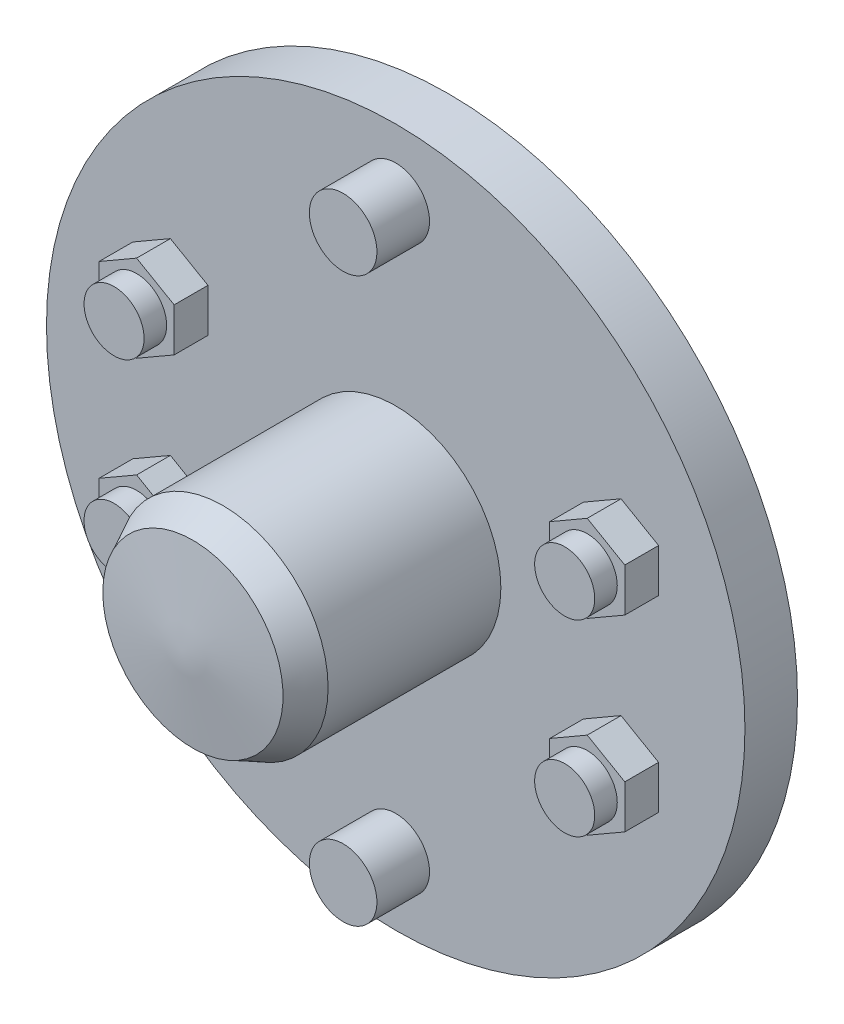
ISO-10303-21;
HEADER;
FILE_DESCRIPTION(('STEP AP214'),'2;1');
FILE_NAME('part.step','',(''),(''),'','','');
FILE_SCHEMA(('AUTOMOTIVE_DESIGN { 1 0 10303 214 1 1 1 1 }'));
ENDSEC;
DATA;
#1=APPLICATION_CONTEXT('core data for automotive mechanical design processes');
#2=APPLICATION_PROTOCOL_DEFINITION('international standard','automotive_design',2000,#1);
#3=PRODUCT_CONTEXT('',#1,'mechanical');
#4=PRODUCT('Part','Part','',(#3));
#5=PRODUCT_RELATED_PRODUCT_CATEGORY('part','',(#4));
#6=PRODUCT_DEFINITION_FORMATION('','',#4);
#7=PRODUCT_DEFINITION_CONTEXT('part definition',#1,'design');
#8=PRODUCT_DEFINITION('design','',#6,#7);
#9=PRODUCT_DEFINITION_SHAPE('','',#8);
#10=(LENGTH_UNIT() NAMED_UNIT(*) SI_UNIT(.MILLI.,.METRE.));
#11=(NAMED_UNIT(*) PLANE_ANGLE_UNIT() SI_UNIT($,.RADIAN.));
#12=(NAMED_UNIT(*) SI_UNIT($,.STERADIAN.) SOLID_ANGLE_UNIT());
#13=UNCERTAINTY_MEASURE_WITH_UNIT(LENGTH_MEASURE(1.E-05),#10,'distance_accuracy_value','');
#14=(GEOMETRIC_REPRESENTATION_CONTEXT(3) GLOBAL_UNCERTAINTY_ASSIGNED_CONTEXT((#13)) GLOBAL_UNIT_ASSIGNED_CONTEXT((#10,
#11,#12)) REPRESENTATION_CONTEXT('',''));
#15=CARTESIAN_POINT('',(0.,0.,0.));
#16=DIRECTION('',(0.,0.,1.));
#17=DIRECTION('',(1.,0.,0.));
#18=AXIS2_PLACEMENT_3D('',#15,#16,#17);
#19=CARTESIAN_POINT('',(190.,-30.7735026918963,332.));
#20=DIRECTION('',(-1.,0.,0.));
#21=DIRECTION('',(0.,0.,1.));
#22=AXIS2_PLACEMENT_3D('',#19,#20,#21);
#23=PLANE('',#22);
#24=DIRECTION('',(0.,1.,0.));
#25=VECTOR('',#24,1.);
#26=CARTESIAN_POINT('',(190.,-30.7735026918963,323.));
#27=LINE('',#26,#25);
#28=CARTESIAN_POINT('',(190.,-30.7735026918963,323.));
#29=VERTEX_POINT('',#28);
#30=CARTESIAN_POINT('',(190.,-19.2264973081037,323.));
#31=VERTEX_POINT('',#30);
#32=EDGE_CURVE('E226',#29,#31,#27,.T.);
#33=ORIENTED_EDGE('',*,*,#32,.T.);
#34=DIRECTION('',(0.,0.,-1.));
#35=VECTOR('',#34,1.);
#36=CARTESIAN_POINT('',(190.,-19.2264973081037,332.));
#37=LINE('',#36,#35);
#38=CARTESIAN_POINT('',(190.,-19.2264973081037,332.));
#39=VERTEX_POINT('',#38);
#40=EDGE_CURVE('E42',#39,#31,#37,.T.);
#41=ORIENTED_EDGE('',*,*,#40,.F.);
#42=DIRECTION('',(0.,1.,0.));
#43=VECTOR('',#42,1.);
#44=CARTESIAN_POINT('',(190.,-30.7735026918963,332.));
#45=LINE('',#44,#43);
#46=CARTESIAN_POINT('',(190.,-30.7735026918963,332.));
#47=VERTEX_POINT('',#46);
#48=EDGE_CURVE('E255',#47,#39,#45,.T.);
#49=ORIENTED_EDGE('',*,*,#48,.F.);
#50=DIRECTION('',(0.,0.,-1.));
#51=VECTOR('',#50,1.);
#52=CARTESIAN_POINT('',(190.,-30.7735026918963,332.));
#53=LINE('',#52,#51);
#54=EDGE_CURVE('E228',#47,#29,#53,.T.);
#55=ORIENTED_EDGE('',*,*,#54,.T.);
#56=EDGE_LOOP('',(#33,#41,#49,#55));
#57=FACE_BOUND('',#56,.T.);
#58=ADVANCED_FACE('F41',(#57),#23,.F.);
#59=CARTESIAN_POINT('',(190.,-19.2264973081037,332.));
#60=DIRECTION('',(-0.5,-0.866025403784439,0.));
#61=DIRECTION('',(0.866025403784439,-0.5,0.));
#62=AXIS2_PLACEMENT_3D('',#59,#60,#61);
#63=PLANE('',#62);
#64=DIRECTION('',(-0.866025403784439,0.5,0.));
#65=VECTOR('',#64,1.);
#66=CARTESIAN_POINT('',(190.,-19.2264973081037,323.));
#67=LINE('',#66,#65);
#68=CARTESIAN_POINT('',(180.,-13.4529946162075,323.));
#69=VERTEX_POINT('',#68);
#70=EDGE_CURVE('E235',#31,#69,#67,.T.);
#71=ORIENTED_EDGE('',*,*,#70,.T.);
#72=DIRECTION('',(0.,0.,-1.));
#73=VECTOR('',#72,1.);
#74=CARTESIAN_POINT('',(180.,-13.4529946162075,332.));
#75=LINE('',#74,#73);
#76=CARTESIAN_POINT('',(180.,-13.4529946162075,332.));
#77=VERTEX_POINT('',#76);
#78=EDGE_CURVE('E262',#77,#69,#75,.T.);
#79=ORIENTED_EDGE('',*,*,#78,.F.);
#80=DIRECTION('',(-0.866025403784439,0.5,0.));
#81=VECTOR('',#80,1.);
#82=CARTESIAN_POINT('',(190.,-19.2264973081037,332.));
#83=LINE('',#82,#81);
#84=EDGE_CURVE('E267',#39,#77,#83,.T.);
#85=ORIENTED_EDGE('',*,*,#84,.F.);
#86=ORIENTED_EDGE('',*,*,#40,.T.);
#87=EDGE_LOOP('',(#71,#79,#85,#86));
#88=FACE_BOUND('',#87,.T.);
#89=ADVANCED_FACE('F216',(#88),#63,.F.);
#90=CARTESIAN_POINT('',(180.,-13.4529946162075,332.));
#91=DIRECTION('',(0.500000000000001,-0.866025403784438,0.));
#92=DIRECTION('',(0.866025403784438,0.500000000000001,0.));
#93=AXIS2_PLACEMENT_3D('',#90,#91,#92);
#94=PLANE('',#93);
#95=DIRECTION('',(-0.866025403784438,-0.500000000000001,0.));
#96=VECTOR('',#95,1.);
#97=CARTESIAN_POINT('',(180.,-13.4529946162075,323.));
#98=LINE('',#97,#96);
#99=CARTESIAN_POINT('',(170.,-19.2264973081037,323.));
#100=VERTEX_POINT('',#99);
#101=EDGE_CURVE('E237',#69,#100,#98,.T.);
#102=ORIENTED_EDGE('',*,*,#101,.T.);
#103=DIRECTION('',(0.,0.,-1.));
#104=VECTOR('',#103,1.);
#105=CARTESIAN_POINT('',(170.,-19.2264973081037,332.));
#106=LINE('',#105,#104);
#107=CARTESIAN_POINT('',(170.,-19.2264973081037,332.));
#108=VERTEX_POINT('',#107);
#109=EDGE_CURVE('E265',#108,#100,#106,.T.);
#110=ORIENTED_EDGE('',*,*,#109,.F.);
#111=DIRECTION('',(-0.866025403784438,-0.500000000000001,0.));
#112=VECTOR('',#111,1.);
#113=CARTESIAN_POINT('',(180.,-13.4529946162075,332.));
#114=LINE('',#113,#112);
#115=EDGE_CURVE('E269',#77,#108,#114,.T.);
#116=ORIENTED_EDGE('',*,*,#115,.F.);
#117=ORIENTED_EDGE('',*,*,#78,.T.);
#118=EDGE_LOOP('',(#102,#110,#116,#117));
#119=FACE_BOUND('',#118,.T.);
#120=ADVANCED_FACE('F219',(#119),#94,.F.);
#121=CARTESIAN_POINT('',(170.,-19.2264973081037,332.));
#122=DIRECTION('',(1.,0.,0.));
#123=DIRECTION('',(0.,0.,-1.));
#124=AXIS2_PLACEMENT_3D('',#121,#122,#123);
#125=PLANE('',#124);
#126=DIRECTION('',(0.,-1.,0.));
#127=VECTOR('',#126,1.);
#128=CARTESIAN_POINT('',(170.,-19.2264973081037,323.));
#129=LINE('',#128,#127);
#130=CARTESIAN_POINT('',(170.,-30.7735026918963,323.));
#131=VERTEX_POINT('',#130);
#132=EDGE_CURVE('E247',#100,#131,#129,.T.);
#133=ORIENTED_EDGE('',*,*,#132,.T.);
#134=DIRECTION('',(0.,0.,-1.));
#135=VECTOR('',#134,1.);
#136=CARTESIAN_POINT('',(170.,-30.7735026918963,332.));
#137=LINE('',#136,#135);
#138=CARTESIAN_POINT('',(170.,-30.7735026918963,332.));
#139=VERTEX_POINT('',#138);
#140=EDGE_CURVE('E259',#139,#131,#137,.T.);
#141=ORIENTED_EDGE('',*,*,#140,.F.);
#142=DIRECTION('',(0.,-1.,0.));
#143=VECTOR('',#142,1.);
#144=CARTESIAN_POINT('',(170.,-19.2264973081037,332.));
#145=LINE('',#144,#143);
#146=EDGE_CURVE('E279',#108,#139,#145,.T.);
#147=ORIENTED_EDGE('',*,*,#146,.F.);
#148=ORIENTED_EDGE('',*,*,#109,.T.);
#149=EDGE_LOOP('',(#133,#141,#147,#148));
#150=FACE_BOUND('',#149,.T.);
#151=ADVANCED_FACE('F286',(#150),#125,.F.);
#152=CARTESIAN_POINT('',(170.,-30.7735026918963,332.));
#153=DIRECTION('',(0.500000000000001,0.866025403784438,0.));
#154=DIRECTION('',(-0.866025403784438,0.500000000000001,0.));
#155=AXIS2_PLACEMENT_3D('',#152,#153,#154);
#156=PLANE('',#155);
#157=DIRECTION('',(0.866025403784438,-0.500000000000001,0.));
#158=VECTOR('',#157,1.);
#159=CARTESIAN_POINT('',(170.,-30.7735026918963,323.));
#160=LINE('',#159,#158);
#161=CARTESIAN_POINT('',(180.,-36.5470053837925,323.));
#162=VERTEX_POINT('',#161);
#163=EDGE_CURVE('E249',#131,#162,#160,.T.);
#164=ORIENTED_EDGE('',*,*,#163,.T.);
#165=DIRECTION('',(0.,0.,-1.));
#166=VECTOR('',#165,1.);
#167=CARTESIAN_POINT('',(180.,-36.5470053837925,332.));
#168=LINE('',#167,#166);
#169=CARTESIAN_POINT('',(180.,-36.5470053837925,332.));
#170=VERTEX_POINT('',#169);
#171=EDGE_CURVE('E258',#170,#162,#168,.T.);
#172=ORIENTED_EDGE('',*,*,#171,.F.);
#173=DIRECTION('',(0.866025403784438,-0.500000000000001,0.));
#174=VECTOR('',#173,1.);
#175=CARTESIAN_POINT('',(170.,-30.7735026918963,332.));
#176=LINE('',#175,#174);
#177=EDGE_CURVE('E276',#139,#170,#176,.T.);
#178=ORIENTED_EDGE('',*,*,#177,.F.);
#179=ORIENTED_EDGE('',*,*,#140,.T.);
#180=EDGE_LOOP('',(#164,#172,#178,#179));
#181=FACE_BOUND('',#180,.T.);
#182=ADVANCED_FACE('F285',(#181),#156,.F.);
#183=CARTESIAN_POINT('',(180.,-36.5470053837925,332.));
#184=DIRECTION('',(-0.5,0.866025403784439,0.));
#185=DIRECTION('',(-0.866025403784439,-0.5,0.));
#186=AXIS2_PLACEMENT_3D('',#183,#184,#185);
#187=PLANE('',#186);
#188=DIRECTION('',(0.866025403784439,0.5,0.));
#189=VECTOR('',#188,1.);
#190=CARTESIAN_POINT('',(180.,-36.5470053837925,323.));
#191=LINE('',#190,#189);
#192=EDGE_CURVE('E252',#162,#29,#191,.T.);
#193=ORIENTED_EDGE('',*,*,#192,.T.);
#194=ORIENTED_EDGE('',*,*,#54,.F.);
#195=DIRECTION('',(0.866025403784439,0.5,0.));
#196=VECTOR('',#195,1.);
#197=CARTESIAN_POINT('',(180.,-36.5470053837925,332.));
#198=LINE('',#197,#196);
#199=EDGE_CURVE('E60',#170,#47,#198,.T.);
#200=ORIENTED_EDGE('',*,*,#199,.F.);
#201=ORIENTED_EDGE('',*,*,#171,.T.);
#202=EDGE_LOOP('',(#193,#194,#200,#201));
#203=FACE_BOUND('',#202,.T.);
#204=ADVANCED_FACE('F290',(#203),#187,.F.);
#205=CARTESIAN_POINT('',(0.,0.,332.));
#206=DIRECTION('',(0.,0.,1.));
#207=DIRECTION('',(1.,0.,0.));
#208=AXIS2_PLACEMENT_3D('',#205,#206,#207);
#209=PLANE('',#208);
#210=CARTESIAN_POINT('',(180.,-25.,332.));
#211=DIRECTION('',(0.,0.,1.));
#212=DIRECTION('',(1.,0.,0.));
#213=AXIS2_PLACEMENT_3D('',#210,#211,#212);
#214=CIRCLE('',#213,8.00000000000001);
#215=CARTESIAN_POINT('',(188.,-25.,332.));
#216=VERTEX_POINT('',#215);
#217=EDGE_CURVE('E11',#216,#216,#214,.T.);
#218=ORIENTED_EDGE('',*,*,#217,.F.);
#219=EDGE_LOOP('',(#218));
#220=FACE_BOUND('',#219,.T.);
#221=ORIENTED_EDGE('',*,*,#48,.T.);
#222=ORIENTED_EDGE('',*,*,#84,.T.);
#223=ORIENTED_EDGE('',*,*,#115,.T.);
#224=ORIENTED_EDGE('',*,*,#146,.T.);
#225=ORIENTED_EDGE('',*,*,#177,.T.);
#226=ORIENTED_EDGE('',*,*,#199,.T.);
#227=EDGE_LOOP('',(#221,#222,#223,#224,#225,#226));
#228=FACE_BOUND('',#227,.T.);
#229=ADVANCED_FACE('F275',(#220,#228),#209,.T.);
#230=CARTESIAN_POINT('',(240.,0.,323.));
#231=DIRECTION('',(0.,0.,1.));
#232=DIRECTION('',(1.,0.,0.));
#233=AXIS2_PLACEMENT_3D('',#230,#231,#232);
#234=PLANE('',#233);
#235=DIRECTION('',(0.,1.,0.));
#236=VECTOR('',#235,1.);
#237=CARTESIAN_POINT('',(310.,19.2264973081037,323.));
#238=LINE('',#237,#236);
#239=CARTESIAN_POINT('',(310.,19.2264973081037,323.));
#240=VERTEX_POINT('',#239);
#241=CARTESIAN_POINT('',(310.,30.7735026918963,323.));
#242=VERTEX_POINT('',#241);
#243=EDGE_CURVE('E574',#240,#242,#238,.T.);
#244=ORIENTED_EDGE('',*,*,#243,.F.);
#245=DIRECTION('',(0.866025403784439,0.5,0.));
#246=VECTOR('',#245,1.);
#247=CARTESIAN_POINT('',(300.,13.4529946162075,323.));
#248=LINE('',#247,#246);
#249=CARTESIAN_POINT('',(300.,13.4529946162075,323.));
#250=VERTEX_POINT('',#249);
#251=EDGE_CURVE('E576',#250,#240,#248,.T.);
#252=ORIENTED_EDGE('',*,*,#251,.F.);
#253=DIRECTION('',(0.866025403784439,-0.5,0.));
#254=VECTOR('',#253,1.);
#255=CARTESIAN_POINT('',(290.,19.2264973081037,323.));
#256=LINE('',#255,#254);
#257=CARTESIAN_POINT('',(290.,19.2264973081037,323.));
#258=VERTEX_POINT('',#257);
#259=EDGE_CURVE('E605',#258,#250,#256,.T.);
#260=ORIENTED_EDGE('',*,*,#259,.F.);
#261=DIRECTION('',(0.,-1.,0.));
#262=VECTOR('',#261,1.);
#263=CARTESIAN_POINT('',(290.,30.7735026918963,323.));
#264=LINE('',#263,#262);
#265=CARTESIAN_POINT('',(290.,30.7735026918963,323.));
#266=VERTEX_POINT('',#265);
#267=EDGE_CURVE('E597',#266,#258,#264,.T.);
#268=ORIENTED_EDGE('',*,*,#267,.F.);
#269=DIRECTION('',(-0.866025403784439,-0.499999999999999,0.));
#270=VECTOR('',#269,1.);
#271=CARTESIAN_POINT('',(300.,36.5470053837925,323.));
#272=LINE('',#271,#270);
#273=CARTESIAN_POINT('',(300.,36.5470053837925,323.));
#274=VERTEX_POINT('',#273);
#275=EDGE_CURVE('E596',#274,#266,#272,.T.);
#276=ORIENTED_EDGE('',*,*,#275,.F.);
#277=DIRECTION('',(-0.866025403784439,0.5,0.));
#278=VECTOR('',#277,1.);
#279=CARTESIAN_POINT('',(310.,30.7735026918963,323.));
#280=LINE('',#279,#278);
#281=EDGE_CURVE('E593',#242,#274,#280,.T.);
#282=ORIENTED_EDGE('',*,*,#281,.F.);
#283=EDGE_LOOP('',(#244,#252,#260,#268,#276,#282));
#284=FACE_BOUND('',#283,.T.);
#285=CARTESIAN_POINT('',(240.,0.,323.));
#286=DIRECTION('',(0.,0.,1.));
#287=DIRECTION('',(1.,0.,0.));
#288=AXIS2_PLACEMENT_3D('',#285,#286,#287);
#289=CIRCLE('',#288,28.);
#290=CARTESIAN_POINT('',(268.,0.,323.));
#291=VERTEX_POINT('',#290);
#292=EDGE_CURVE('E563',#291,#291,#289,.T.);
#293=ORIENTED_EDGE('',*,*,#292,.F.);
#294=EDGE_LOOP('',(#293));
#295=FACE_BOUND('',#294,.T.);
#296=CARTESIAN_POINT('',(240.,75.,323.));
#297=DIRECTION('',(0.,0.,1.));
#298=DIRECTION('',(1.,0.,0.));
#299=AXIS2_PLACEMENT_3D('',#296,#297,#298);
#300=CIRCLE('',#299,9.00000000000001);
#301=CARTESIAN_POINT('',(249.,75.,323.));
#302=VERTEX_POINT('',#301);
#303=EDGE_CURVE('E557',#302,#302,#300,.T.);
#304=ORIENTED_EDGE('',*,*,#303,.F.);
#305=EDGE_LOOP('',(#304));
#306=FACE_BOUND('',#305,.T.);
#307=DIRECTION('',(0.,1.,0.));
#308=VECTOR('',#307,1.);
#309=CARTESIAN_POINT('',(310.,-30.7735026918963,323.));
#310=LINE('',#309,#308);
#311=CARTESIAN_POINT('',(310.,-30.7735026918963,323.));
#312=VERTEX_POINT('',#311);
#313=CARTESIAN_POINT('',(310.,-19.2264973081037,323.));
#314=VERTEX_POINT('',#313);
#315=EDGE_CURVE('E459',#312,#314,#310,.T.);
#316=ORIENTED_EDGE('',*,*,#315,.F.);
#317=DIRECTION('',(0.866025403784439,0.5,0.));
#318=VECTOR('',#317,1.);
#319=CARTESIAN_POINT('',(300.,-36.5470053837925,323.));
#320=LINE('',#319,#318);
#321=CARTESIAN_POINT('',(300.,-36.5470053837925,323.));
#322=VERTEX_POINT('',#321);
#323=EDGE_CURVE('E467',#322,#312,#320,.T.);
#324=ORIENTED_EDGE('',*,*,#323,.F.);
#325=DIRECTION('',(0.866025403784439,-0.5,0.));
#326=VECTOR('',#325,1.);
#327=CARTESIAN_POINT('',(290.,-30.7735026918963,323.));
#328=LINE('',#327,#326);
#329=CARTESIAN_POINT('',(290.,-30.7735026918963,323.));
#330=VERTEX_POINT('',#329);
#331=EDGE_CURVE('E488',#330,#322,#328,.T.);
#332=ORIENTED_EDGE('',*,*,#331,.F.);
#333=DIRECTION('',(0.,-1.,0.));
#334=VECTOR('',#333,1.);
#335=CARTESIAN_POINT('',(290.,-19.2264973081037,323.));
#336=LINE('',#335,#334);
#337=CARTESIAN_POINT('',(290.,-19.2264973081037,323.));
#338=VERTEX_POINT('',#337);
#339=EDGE_CURVE('E484',#338,#330,#336,.T.);
#340=ORIENTED_EDGE('',*,*,#339,.F.);
#341=DIRECTION('',(-0.866025403784439,-0.499999999999999,0.));
#342=VECTOR('',#341,1.);
#343=CARTESIAN_POINT('',(300.,-13.4529946162075,323.));
#344=LINE('',#343,#342);
#345=CARTESIAN_POINT('',(300.,-13.4529946162075,323.));
#346=VERTEX_POINT('',#345);
#347=EDGE_CURVE('E485',#346,#338,#344,.T.);
#348=ORIENTED_EDGE('',*,*,#347,.F.);
#349=DIRECTION('',(-0.866025403784439,0.5,0.));
#350=VECTOR('',#349,1.);
#351=CARTESIAN_POINT('',(310.,-19.2264973081037,323.));
#352=LINE('',#351,#350);
#353=EDGE_CURVE('E479',#314,#346,#352,.T.);
#354=ORIENTED_EDGE('',*,*,#353,.F.);
#355=EDGE_LOOP('',(#316,#324,#332,#340,#348,#354));
#356=FACE_BOUND('',#355,.T.);
#357=CARTESIAN_POINT('',(240.,-75.,323.));
#358=DIRECTION('',(0.,0.,1.));
#359=DIRECTION('',(1.,0.,0.));
#360=AXIS2_PLACEMENT_3D('',#357,#358,#359);
#361=CIRCLE('',#360,9.00000000000001);
#362=CARTESIAN_POINT('',(249.,-75.,323.));
#363=VERTEX_POINT('',#362);
#364=EDGE_CURVE('E454',#363,#363,#361,.T.);
#365=ORIENTED_EDGE('',*,*,#364,.F.);
#366=EDGE_LOOP('',(#365));
#367=FACE_BOUND('',#366,.T.);
#368=CARTESIAN_POINT('',(240.,0.,323.));
#369=DIRECTION('',(0.,0.,1.));
#370=DIRECTION('',(1.,0.,0.));
#371=AXIS2_PLACEMENT_3D('',#368,#369,#370);
#372=CIRCLE('',#371,93.);
#373=CARTESIAN_POINT('',(333.,0.,323.));
#374=VERTEX_POINT('',#373);
#375=EDGE_CURVE('E445',#374,#374,#372,.T.);
#376=ORIENTED_EDGE('',*,*,#375,.T.);
#377=EDGE_LOOP('',(#376));
#378=FACE_BOUND('',#377,.T.);
#379=DIRECTION('',(0.,1.,0.));
#380=VECTOR('',#379,1.);
#381=CARTESIAN_POINT('',(190.,19.2264973081037,323.));
#382=LINE('',#381,#380);
#383=CARTESIAN_POINT('',(190.,19.2264973081037,323.));
#384=VERTEX_POINT('',#383);
#385=CARTESIAN_POINT('',(190.,30.7735026918963,323.));
#386=VERTEX_POINT('',#385);
#387=EDGE_CURVE('E452',#384,#386,#382,.T.);
#388=ORIENTED_EDGE('',*,*,#387,.F.);
#389=DIRECTION('',(0.866025403784439,0.5,0.));
#390=VECTOR('',#389,1.);
#391=CARTESIAN_POINT('',(180.,13.4529946162075,323.));
#392=LINE('',#391,#390);
#393=CARTESIAN_POINT('',(180.,13.4529946162075,323.));
#394=VERTEX_POINT('',#393);
#395=EDGE_CURVE('E511',#394,#384,#392,.T.);
#396=ORIENTED_EDGE('',*,*,#395,.F.);
#397=DIRECTION('',(0.866025403784438,-0.500000000000001,0.));
#398=VECTOR('',#397,1.);
#399=CARTESIAN_POINT('',(170.,19.2264973081037,323.));
#400=LINE('',#399,#398);
#401=CARTESIAN_POINT('',(170.,19.2264973081037,323.));
#402=VERTEX_POINT('',#401);
#403=EDGE_CURVE('E532',#402,#394,#400,.T.);
#404=ORIENTED_EDGE('',*,*,#403,.F.);
#405=DIRECTION('',(0.,-1.,0.));
#406=VECTOR('',#405,1.);
#407=CARTESIAN_POINT('',(170.,30.7735026918963,323.));
#408=LINE('',#407,#406);
#409=CARTESIAN_POINT('',(170.,30.7735026918963,323.));
#410=VERTEX_POINT('',#409);
#411=EDGE_CURVE('E535',#410,#402,#408,.T.);
#412=ORIENTED_EDGE('',*,*,#411,.F.);
#413=DIRECTION('',(-0.866025403784438,-0.500000000000001,0.));
#414=VECTOR('',#413,1.);
#415=CARTESIAN_POINT('',(180.,36.5470053837925,323.));
#416=LINE('',#415,#414);
#417=CARTESIAN_POINT('',(180.,36.5470053837925,323.));
#418=VERTEX_POINT('',#417);
#419=EDGE_CURVE('E530',#418,#410,#416,.T.);
#420=ORIENTED_EDGE('',*,*,#419,.F.);
#421=DIRECTION('',(-0.866025403784439,0.5,0.));
#422=VECTOR('',#421,1.);
#423=CARTESIAN_POINT('',(190.,30.7735026918963,323.));
#424=LINE('',#423,#422);
#425=EDGE_CURVE('E528',#386,#418,#424,.T.);
#426=ORIENTED_EDGE('',*,*,#425,.F.);
#427=EDGE_LOOP('',(#388,#396,#404,#412,#420,#426));
#428=FACE_BOUND('',#427,.T.);
#429=ORIENTED_EDGE('',*,*,#32,.F.);
#430=ORIENTED_EDGE('',*,*,#192,.F.);
#431=ORIENTED_EDGE('',*,*,#163,.F.);
#432=ORIENTED_EDGE('',*,*,#132,.F.);
#433=ORIENTED_EDGE('',*,*,#101,.F.);
#434=ORIENTED_EDGE('',*,*,#70,.F.);
#435=EDGE_LOOP('',(#429,#430,#431,#432,#433,#434));
#436=FACE_BOUND('',#435,.T.);
#437=ADVANCED_FACE('F288',(#284,#295,#306,#356,#367,#378,#428,#436),#234,.T.);
#438=CARTESIAN_POINT('',(310.,19.2264973081037,332.));
#439=DIRECTION('',(-1.,0.,0.));
#440=DIRECTION('',(0.,0.,1.));
#441=AXIS2_PLACEMENT_3D('',#438,#439,#440);
#442=PLANE('',#441);
#443=ORIENTED_EDGE('',*,*,#243,.T.);
#444=DIRECTION('',(0.,0.,-1.));
#445=VECTOR('',#444,1.);
#446=CARTESIAN_POINT('',(310.,30.7735026918963,332.));
#447=LINE('',#446,#445);
#448=CARTESIAN_POINT('',(310.,30.7735026918963,332.));
#449=VERTEX_POINT('',#448);
#450=EDGE_CURVE('E239',#449,#242,#447,.T.);
#451=ORIENTED_EDGE('',*,*,#450,.F.);
#452=DIRECTION('',(0.,1.,0.));
#453=VECTOR('',#452,1.);
#454=CARTESIAN_POINT('',(310.,19.2264973081037,332.));
#455=LINE('',#454,#453);
#456=CARTESIAN_POINT('',(310.,19.2264973081037,332.));
#457=VERTEX_POINT('',#456);
#458=EDGE_CURVE('E577',#457,#449,#455,.T.);
#459=ORIENTED_EDGE('',*,*,#458,.F.);
#460=DIRECTION('',(0.,0.,-1.));
#461=VECTOR('',#460,1.);
#462=CARTESIAN_POINT('',(310.,19.2264973081037,332.));
#463=LINE('',#462,#461);
#464=EDGE_CURVE('E587',#457,#240,#463,.T.);
#465=ORIENTED_EDGE('',*,*,#464,.T.);
#466=EDGE_LOOP('',(#443,#451,#459,#465));
#467=FACE_BOUND('',#466,.T.);
#468=ADVANCED_FACE('F301',(#467),#442,.F.);
#469=CARTESIAN_POINT('',(310.,30.7735026918963,332.));
#470=DIRECTION('',(-0.5,-0.866025403784439,0.));
#471=DIRECTION('',(0.866025403784439,-0.5,0.));
#472=AXIS2_PLACEMENT_3D('',#469,#470,#471);
#473=PLANE('',#472);
#474=ORIENTED_EDGE('',*,*,#281,.T.);
#475=DIRECTION('',(0.,0.,-1.));
#476=VECTOR('',#475,1.);
#477=CARTESIAN_POINT('',(300.,36.5470053837925,332.));
#478=LINE('',#477,#476);
#479=CARTESIAN_POINT('',(300.,36.5470053837925,332.));
#480=VERTEX_POINT('',#479);
#481=EDGE_CURVE('E620',#480,#274,#478,.T.);
#482=ORIENTED_EDGE('',*,*,#481,.F.);
#483=DIRECTION('',(-0.866025403784439,0.5,0.));
#484=VECTOR('',#483,1.);
#485=CARTESIAN_POINT('',(310.,30.7735026918963,332.));
#486=LINE('',#485,#484);
#487=EDGE_CURVE('E579',#449,#480,#486,.T.);
#488=ORIENTED_EDGE('',*,*,#487,.F.);
#489=ORIENTED_EDGE('',*,*,#450,.T.);
#490=EDGE_LOOP('',(#474,#482,#488,#489));
#491=FACE_BOUND('',#490,.T.);
#492=ADVANCED_FACE('F306',(#491),#473,.F.);
#493=CARTESIAN_POINT('',(300.,36.5470053837925,332.));
#494=DIRECTION('',(0.499999999999999,-0.866025403784439,0.));
#495=DIRECTION('',(0.866025403784439,0.5,0.));
#496=AXIS2_PLACEMENT_3D('',#493,#494,#495);
#497=PLANE('',#496);
#498=ORIENTED_EDGE('',*,*,#275,.T.);
#499=DIRECTION('',(0.,0.,-1.));
#500=VECTOR('',#499,1.);
#501=CARTESIAN_POINT('',(290.,30.7735026918963,332.));
#502=LINE('',#501,#500);
#503=CARTESIAN_POINT('',(290.,30.7735026918963,332.));
#504=VERTEX_POINT('',#503);
#505=EDGE_CURVE('E615',#504,#266,#502,.T.);
#506=ORIENTED_EDGE('',*,*,#505,.F.);
#507=DIRECTION('',(-0.866025403784439,-0.499999999999999,0.));
#508=VECTOR('',#507,1.);
#509=CARTESIAN_POINT('',(300.,36.5470053837925,332.));
#510=LINE('',#509,#508);
#511=EDGE_CURVE('E582',#480,#504,#510,.T.);
#512=ORIENTED_EDGE('',*,*,#511,.F.);
#513=ORIENTED_EDGE('',*,*,#481,.T.);
#514=EDGE_LOOP('',(#498,#506,#512,#513));
#515=FACE_BOUND('',#514,.T.);
#516=ADVANCED_FACE('F315',(#515),#497,.F.);
#517=CARTESIAN_POINT('',(290.,30.7735026918963,332.));
#518=DIRECTION('',(1.,0.,0.));
#519=DIRECTION('',(0.,0.,-1.));
#520=AXIS2_PLACEMENT_3D('',#517,#518,#519);
#521=PLANE('',#520);
#522=ORIENTED_EDGE('',*,*,#267,.T.);
#523=DIRECTION('',(0.,0.,-1.));
#524=VECTOR('',#523,1.);
#525=CARTESIAN_POINT('',(290.,19.2264973081037,332.));
#526=LINE('',#525,#524);
#527=CARTESIAN_POINT('',(290.,19.2264973081037,332.));
#528=VERTEX_POINT('',#527);
#529=EDGE_CURVE('E612',#528,#258,#526,.T.);
#530=ORIENTED_EDGE('',*,*,#529,.F.);
#531=DIRECTION('',(0.,-1.,0.));
#532=VECTOR('',#531,1.);
#533=CARTESIAN_POINT('',(290.,30.7735026918963,332.));
#534=LINE('',#533,#532);
#535=EDGE_CURVE('E585',#504,#528,#534,.T.);
#536=ORIENTED_EDGE('',*,*,#535,.F.);
#537=ORIENTED_EDGE('',*,*,#505,.T.);
#538=EDGE_LOOP('',(#522,#530,#536,#537));
#539=FACE_BOUND('',#538,.T.);
#540=ADVANCED_FACE('F316',(#539),#521,.F.);
#541=CARTESIAN_POINT('',(290.,19.2264973081037,332.));
#542=DIRECTION('',(0.5,0.866025403784439,0.));
#543=DIRECTION('',(-0.866025403784439,0.5,0.));
#544=AXIS2_PLACEMENT_3D('',#541,#542,#543);
#545=PLANE('',#544);
#546=ORIENTED_EDGE('',*,*,#259,.T.);
#547=DIRECTION('',(0.,0.,-1.));
#548=VECTOR('',#547,1.);
#549=CARTESIAN_POINT('',(300.,13.4529946162075,332.));
#550=LINE('',#549,#548);
#551=CARTESIAN_POINT('',(300.,13.4529946162075,332.));
#552=VERTEX_POINT('',#551);
#553=EDGE_CURVE('E606',#552,#250,#550,.T.);
#554=ORIENTED_EDGE('',*,*,#553,.F.);
#555=DIRECTION('',(0.866025403784439,-0.5,0.));
#556=VECTOR('',#555,1.);
#557=CARTESIAN_POINT('',(290.,19.2264973081037,332.));
#558=LINE('',#557,#556);
#559=EDGE_CURVE('E588',#528,#552,#558,.T.);
#560=ORIENTED_EDGE('',*,*,#559,.F.);
#561=ORIENTED_EDGE('',*,*,#529,.T.);
#562=EDGE_LOOP('',(#546,#554,#560,#561));
#563=FACE_BOUND('',#562,.T.);
#564=ADVANCED_FACE('F319',(#563),#545,.F.);
#565=CARTESIAN_POINT('',(300.,13.4529946162075,332.));
#566=DIRECTION('',(-0.5,0.866025403784439,0.));
#567=DIRECTION('',(-0.866025403784439,-0.5,0.));
#568=AXIS2_PLACEMENT_3D('',#565,#566,#567);
#569=PLANE('',#568);
#570=ORIENTED_EDGE('',*,*,#251,.T.);
#571=ORIENTED_EDGE('',*,*,#464,.F.);
#572=DIRECTION('',(0.866025403784439,0.5,0.));
#573=VECTOR('',#572,1.);
#574=CARTESIAN_POINT('',(300.,13.4529946162075,332.));
#575=LINE('',#574,#573);
#576=EDGE_CURVE('E586',#552,#457,#575,.T.);
#577=ORIENTED_EDGE('',*,*,#576,.F.);
#578=ORIENTED_EDGE('',*,*,#553,.T.);
#579=EDGE_LOOP('',(#570,#571,#577,#578));
#580=FACE_BOUND('',#579,.T.);
#581=ADVANCED_FACE('F322',(#580),#569,.F.);
#582=CARTESIAN_POINT('',(0.,0.,332.));
#583=DIRECTION('',(0.,0.,1.));
#584=DIRECTION('',(1.,0.,0.));
#585=AXIS2_PLACEMENT_3D('',#582,#583,#584);
#586=PLANE('',#585);
#587=CARTESIAN_POINT('',(300.,25.,332.));
#588=DIRECTION('',(0.,0.,1.));
#589=DIRECTION('',(1.,0.,0.));
#590=AXIS2_PLACEMENT_3D('',#587,#588,#589);
#591=CIRCLE('',#590,8.00000000000001);
#592=CARTESIAN_POINT('',(308.,25.,332.));
#593=VERTEX_POINT('',#592);
#594=EDGE_CURVE('E233',#593,#593,#591,.T.);
#595=ORIENTED_EDGE('',*,*,#594,.F.);
#596=EDGE_LOOP('',(#595));
#597=FACE_BOUND('',#596,.T.);
#598=ORIENTED_EDGE('',*,*,#458,.T.);
#599=ORIENTED_EDGE('',*,*,#487,.T.);
#600=ORIENTED_EDGE('',*,*,#511,.T.);
#601=ORIENTED_EDGE('',*,*,#535,.T.);
#602=ORIENTED_EDGE('',*,*,#559,.T.);
#603=ORIENTED_EDGE('',*,*,#576,.T.);
#604=EDGE_LOOP('',(#598,#599,#600,#601,#602,#603));
#605=FACE_BOUND('',#604,.T.);
#606=ADVANCED_FACE('F327',(#597,#605),#586,.T.);
#607=CARTESIAN_POINT('',(180.,25.,338.));
#608=DIRECTION('',(0.,0.,-1.));
#609=DIRECTION('',(-1.,0.,0.));
#610=AXIS2_PLACEMENT_3D('',#607,#608,#609);
#611=CYLINDRICAL_SURFACE('',#610,8.00000000000001);
#612=CARTESIAN_POINT('',(180.,25.,338.));
#613=DIRECTION('',(0.,0.,1.));
#614=DIRECTION('',(1.,0.,0.));
#615=AXIS2_PLACEMENT_3D('',#612,#613,#614);
#616=CIRCLE('',#615,8.00000000000001);
#617=CARTESIAN_POINT('',(188.,25.,338.));
#618=VERTEX_POINT('',#617);
#619=EDGE_CURVE('E568',#618,#618,#616,.T.);
#620=ORIENTED_EDGE('',*,*,#619,.F.);
#621=EDGE_LOOP('',(#620));
#622=FACE_BOUND('',#621,.T.);
#623=CARTESIAN_POINT('',(180.,25.,332.));
#624=DIRECTION('',(0.,0.,1.));
#625=DIRECTION('',(1.,0.,0.));
#626=AXIS2_PLACEMENT_3D('',#623,#624,#625);
#627=CIRCLE('',#626,8.00000000000001);
#628=CARTESIAN_POINT('',(188.,25.,332.));
#629=VERTEX_POINT('',#628);
#630=EDGE_CURVE('E569',#629,#629,#627,.T.);
#631=ORIENTED_EDGE('',*,*,#630,.T.);
#632=EDGE_LOOP('',(#631));
#633=FACE_BOUND('',#632,.T.);
#634=ADVANCED_FACE('F335',(#622,#633),#611,.T.);
#635=CARTESIAN_POINT('',(180.,25.,338.));
#636=DIRECTION('',(0.,0.,1.));
#637=DIRECTION('',(1.,0.,0.));
#638=AXIS2_PLACEMENT_3D('',#635,#636,#637);
#639=PLANE('',#638);
#640=ORIENTED_EDGE('',*,*,#619,.T.);
#641=EDGE_LOOP('',(#640));
#642=FACE_BOUND('',#641,.T.);
#643=ADVANCED_FACE('F336',(#642),#639,.T.);
#644=CARTESIAN_POINT('',(240.,0.,369.));
#645=DIRECTION('',(0.,0.,-1.));
#646=DIRECTION('',(-1.,0.,0.));
#647=AXIS2_PLACEMENT_3D('',#644,#645,#646);
#648=CYLINDRICAL_SURFACE('',#647,28.);
#649=CARTESIAN_POINT('',(240.,0.,369.));
#650=DIRECTION('',(0.,0.,1.));
#651=DIRECTION('',(1.,0.,0.));
#652=AXIS2_PLACEMENT_3D('',#649,#650,#651);
#653=CIRCLE('',#652,28.);
#654=CARTESIAN_POINT('',(268.,0.,369.));
#655=VERTEX_POINT('',#654);
#656=EDGE_CURVE('E567',#655,#655,#653,.T.);
#657=ORIENTED_EDGE('',*,*,#656,.F.);
#658=EDGE_LOOP('',(#657));
#659=FACE_BOUND('',#658,.T.);
#660=ORIENTED_EDGE('',*,*,#292,.T.);
#661=EDGE_LOOP('',(#660));
#662=FACE_BOUND('',#661,.T.);
#663=ADVANCED_FACE('F340',(#659,#662),#648,.T.);
#664=CARTESIAN_POINT('',(240.,75.,337.));
#665=DIRECTION('',(0.,0.,-1.));
#666=DIRECTION('',(-1.,0.,0.));
#667=AXIS2_PLACEMENT_3D('',#664,#665,#666);
#668=CYLINDRICAL_SURFACE('',#667,9.00000000000001);
#669=CARTESIAN_POINT('',(240.,75.,337.));
#670=DIRECTION('',(0.,0.,1.));
#671=DIRECTION('',(1.,0.,0.));
#672=AXIS2_PLACEMENT_3D('',#669,#670,#671);
#673=CIRCLE('',#672,9.00000000000001);
#674=CARTESIAN_POINT('',(249.,75.,337.));
#675=VERTEX_POINT('',#674);
#676=EDGE_CURVE('E560',#675,#675,#673,.T.);
#677=ORIENTED_EDGE('',*,*,#676,.F.);
#678=EDGE_LOOP('',(#677));
#679=FACE_BOUND('',#678,.T.);
#680=ORIENTED_EDGE('',*,*,#303,.T.);
#681=EDGE_LOOP('',(#680));
#682=FACE_BOUND('',#681,.T.);
#683=ADVANCED_FACE('F344',(#679,#682),#668,.T.);
#684=CARTESIAN_POINT('',(240.,75.,337.));
#685=DIRECTION('',(0.,0.,1.));
#686=DIRECTION('',(1.,0.,0.));
#687=AXIS2_PLACEMENT_3D('',#684,#685,#686);
#688=PLANE('',#687);
#689=ORIENTED_EDGE('',*,*,#676,.T.);
#690=EDGE_LOOP('',(#689));
#691=FACE_BOUND('',#690,.T.);
#692=ADVANCED_FACE('F346',(#691),#688,.T.);
#693=CARTESIAN_POINT('',(190.,19.2264973081037,332.));
#694=DIRECTION('',(-1.,0.,0.));
#695=DIRECTION('',(0.,0.,1.));
#696=AXIS2_PLACEMENT_3D('',#693,#694,#695);
#697=PLANE('',#696);
#698=ORIENTED_EDGE('',*,*,#387,.T.);
#699=DIRECTION('',(0.,0.,-1.));
#700=VECTOR('',#699,1.);
#701=CARTESIAN_POINT('',(190.,30.7735026918963,332.));
#702=LINE('',#701,#700);
#703=CARTESIAN_POINT('',(190.,30.7735026918963,332.));
#704=VERTEX_POINT('',#703);
#705=EDGE_CURVE('E551',#704,#386,#702,.T.);
#706=ORIENTED_EDGE('',*,*,#705,.F.);
#707=DIRECTION('',(0.,1.,0.));
#708=VECTOR('',#707,1.);
#709=CARTESIAN_POINT('',(190.,19.2264973081037,332.));
#710=LINE('',#709,#708);
#711=CARTESIAN_POINT('',(190.,19.2264973081037,332.));
#712=VERTEX_POINT('',#711);
#713=EDGE_CURVE('E509',#712,#704,#710,.T.);
#714=ORIENTED_EDGE('',*,*,#713,.F.);
#715=DIRECTION('',(0.,0.,-1.));
#716=VECTOR('',#715,1.);
#717=CARTESIAN_POINT('',(190.,19.2264973081037,332.));
#718=LINE('',#717,#716);
#719=EDGE_CURVE('E523',#712,#384,#718,.T.);
#720=ORIENTED_EDGE('',*,*,#719,.T.);
#721=EDGE_LOOP('',(#698,#706,#714,#720));
#722=FACE_BOUND('',#721,.T.);
#723=ADVANCED_FACE('F352',(#722),#697,.F.);
#724=CARTESIAN_POINT('',(190.,30.7735026918963,332.));
#725=DIRECTION('',(-0.5,-0.866025403784439,0.));
#726=DIRECTION('',(0.866025403784439,-0.5,0.));
#727=AXIS2_PLACEMENT_3D('',#724,#725,#726);
#728=PLANE('',#727);
#729=ORIENTED_EDGE('',*,*,#425,.T.);
#730=DIRECTION('',(0.,0.,-1.));
#731=VECTOR('',#730,1.);
#732=CARTESIAN_POINT('',(180.,36.5470053837925,332.));
#733=LINE('',#732,#731);
#734=CARTESIAN_POINT('',(180.,36.5470053837925,332.));
#735=VERTEX_POINT('',#734);
#736=EDGE_CURVE('E552',#735,#418,#733,.T.);
#737=ORIENTED_EDGE('',*,*,#736,.F.);
#738=DIRECTION('',(-0.866025403784439,0.5,0.));
#739=VECTOR('',#738,1.);
#740=CARTESIAN_POINT('',(190.,30.7735026918963,332.));
#741=LINE('',#740,#739);
#742=EDGE_CURVE('E515',#704,#735,#741,.T.);
#743=ORIENTED_EDGE('',*,*,#742,.F.);
#744=ORIENTED_EDGE('',*,*,#705,.T.);
#745=EDGE_LOOP('',(#729,#737,#743,#744));
#746=FACE_BOUND('',#745,.T.);
#747=ADVANCED_FACE('F357',(#746),#728,.F.);
#748=CARTESIAN_POINT('',(180.,36.5470053837925,332.));
#749=DIRECTION('',(0.500000000000001,-0.866025403784438,0.));
#750=DIRECTION('',(0.866025403784438,0.500000000000001,0.));
#751=AXIS2_PLACEMENT_3D('',#748,#749,#750);
#752=PLANE('',#751);
#753=ORIENTED_EDGE('',*,*,#419,.T.);
#754=DIRECTION('',(0.,0.,-1.));
#755=VECTOR('',#754,1.);
#756=CARTESIAN_POINT('',(170.,30.7735026918963,332.));
#757=LINE('',#756,#755);
#758=CARTESIAN_POINT('',(170.,30.7735026918963,332.));
#759=VERTEX_POINT('',#758);
#760=EDGE_CURVE('E547',#759,#410,#757,.T.);
#761=ORIENTED_EDGE('',*,*,#760,.F.);
#762=DIRECTION('',(-0.866025403784438,-0.500000000000001,0.));
#763=VECTOR('',#762,1.);
#764=CARTESIAN_POINT('',(180.,36.5470053837925,332.));
#765=LINE('',#764,#763);
#766=EDGE_CURVE('E513',#735,#759,#765,.T.);
#767=ORIENTED_EDGE('',*,*,#766,.F.);
#768=ORIENTED_EDGE('',*,*,#736,.T.);
#769=EDGE_LOOP('',(#753,#761,#767,#768));
#770=FACE_BOUND('',#769,.T.);
#771=ADVANCED_FACE('F356',(#770),#752,.F.);
#772=CARTESIAN_POINT('',(170.,30.7735026918963,332.));
#773=DIRECTION('',(1.,0.,0.));
#774=DIRECTION('',(0.,0.,-1.));
#775=AXIS2_PLACEMENT_3D('',#772,#773,#774);
#776=PLANE('',#775);
#777=ORIENTED_EDGE('',*,*,#411,.T.);
#778=DIRECTION('',(0.,0.,-1.));
#779=VECTOR('',#778,1.);
#780=CARTESIAN_POINT('',(170.,19.2264973081037,332.));
#781=LINE('',#780,#779);
#782=CARTESIAN_POINT('',(170.,19.2264973081037,332.));
#783=VERTEX_POINT('',#782);
#784=EDGE_CURVE('E544',#783,#402,#781,.T.);
#785=ORIENTED_EDGE('',*,*,#784,.F.);
#786=DIRECTION('',(0.,-1.,0.));
#787=VECTOR('',#786,1.);
#788=CARTESIAN_POINT('',(170.,30.7735026918963,332.));
#789=LINE('',#788,#787);
#790=EDGE_CURVE('E517',#759,#783,#789,.T.);
#791=ORIENTED_EDGE('',*,*,#790,.F.);
#792=ORIENTED_EDGE('',*,*,#760,.T.);
#793=EDGE_LOOP('',(#777,#785,#791,#792));
#794=FACE_BOUND('',#793,.T.);
#795=ADVANCED_FACE('F365',(#794),#776,.F.);
#796=CARTESIAN_POINT('',(170.,19.2264973081037,332.));
#797=DIRECTION('',(0.500000000000001,0.866025403784438,0.));
#798=DIRECTION('',(-0.866025403784438,0.500000000000001,0.));
#799=AXIS2_PLACEMENT_3D('',#796,#797,#798);
#800=PLANE('',#799);
#801=ORIENTED_EDGE('',*,*,#403,.T.);
#802=DIRECTION('',(0.,0.,-1.));
#803=VECTOR('',#802,1.);
#804=CARTESIAN_POINT('',(180.,13.4529946162075,332.));
#805=LINE('',#804,#803);
#806=CARTESIAN_POINT('',(180.,13.4529946162075,332.));
#807=VERTEX_POINT('',#806);
#808=EDGE_CURVE('E545',#807,#394,#805,.T.);
#809=ORIENTED_EDGE('',*,*,#808,.F.);
#810=DIRECTION('',(0.866025403784438,-0.500000000000001,0.));
#811=VECTOR('',#810,1.);
#812=CARTESIAN_POINT('',(170.,19.2264973081037,332.));
#813=LINE('',#812,#811);
#814=EDGE_CURVE('E518',#783,#807,#813,.T.);
#815=ORIENTED_EDGE('',*,*,#814,.F.);
#816=ORIENTED_EDGE('',*,*,#784,.T.);
#817=EDGE_LOOP('',(#801,#809,#815,#816));
#818=FACE_BOUND('',#817,.T.);
#819=ADVANCED_FACE('F366',(#818),#800,.F.);
#820=CARTESIAN_POINT('',(180.,13.4529946162075,332.));
#821=DIRECTION('',(-0.5,0.866025403784439,0.));
#822=DIRECTION('',(-0.866025403784439,-0.5,0.));
#823=AXIS2_PLACEMENT_3D('',#820,#821,#822);
#824=PLANE('',#823);
#825=ORIENTED_EDGE('',*,*,#395,.T.);
#826=ORIENTED_EDGE('',*,*,#719,.F.);
#827=DIRECTION('',(0.866025403784439,0.5,0.));
#828=VECTOR('',#827,1.);
#829=CARTESIAN_POINT('',(180.,13.4529946162075,332.));
#830=LINE('',#829,#828);
#831=EDGE_CURVE('E522',#807,#712,#830,.T.);
#832=ORIENTED_EDGE('',*,*,#831,.F.);
#833=ORIENTED_EDGE('',*,*,#808,.T.);
#834=EDGE_LOOP('',(#825,#826,#832,#833));
#835=FACE_BOUND('',#834,.T.);
#836=ADVANCED_FACE('F375',(#835),#824,.F.);
#837=CARTESIAN_POINT('',(0.,0.,332.));
#838=DIRECTION('',(0.,0.,1.));
#839=DIRECTION('',(1.,0.,0.));
#840=AXIS2_PLACEMENT_3D('',#837,#838,#839);
#841=PLANE('',#840);
#842=ORIENTED_EDGE('',*,*,#630,.F.);
#843=EDGE_LOOP('',(#842));
#844=FACE_BOUND('',#843,.T.);
#845=ORIENTED_EDGE('',*,*,#713,.T.);
#846=ORIENTED_EDGE('',*,*,#742,.T.);
#847=ORIENTED_EDGE('',*,*,#766,.T.);
#848=ORIENTED_EDGE('',*,*,#790,.T.);
#849=ORIENTED_EDGE('',*,*,#814,.T.);
#850=ORIENTED_EDGE('',*,*,#831,.T.);
#851=EDGE_LOOP('',(#845,#846,#847,#848,#849,#850));
#852=FACE_BOUND('',#851,.T.);
#853=ADVANCED_FACE('F376',(#844,#852),#841,.T.);
#854=CARTESIAN_POINT('',(310.,-30.7735026918963,332.));
#855=DIRECTION('',(-1.,0.,0.));
#856=DIRECTION('',(0.,0.,1.));
#857=AXIS2_PLACEMENT_3D('',#854,#855,#856);
#858=PLANE('',#857);
#859=ORIENTED_EDGE('',*,*,#315,.T.);
#860=DIRECTION('',(0.,0.,-1.));
#861=VECTOR('',#860,1.);
#862=CARTESIAN_POINT('',(310.,-19.2264973081037,332.));
#863=LINE('',#862,#861);
#864=CARTESIAN_POINT('',(310.,-19.2264973081037,332.));
#865=VERTEX_POINT('',#864);
#866=EDGE_CURVE('E455',#865,#314,#863,.T.);
#867=ORIENTED_EDGE('',*,*,#866,.F.);
#868=DIRECTION('',(0.,1.,0.));
#869=VECTOR('',#868,1.);
#870=CARTESIAN_POINT('',(310.,-30.7735026918963,332.));
#871=LINE('',#870,#869);
#872=CARTESIAN_POINT('',(310.,-30.7735026918963,332.));
#873=VERTEX_POINT('',#872);
#874=EDGE_CURVE('E462',#873,#865,#871,.T.);
#875=ORIENTED_EDGE('',*,*,#874,.F.);
#876=DIRECTION('',(0.,0.,-1.));
#877=VECTOR('',#876,1.);
#878=CARTESIAN_POINT('',(310.,-30.7735026918963,332.));
#879=LINE('',#878,#877);
#880=EDGE_CURVE('E478',#873,#312,#879,.T.);
#881=ORIENTED_EDGE('',*,*,#880,.T.);
#882=EDGE_LOOP('',(#859,#867,#875,#881));
#883=FACE_BOUND('',#882,.T.);
#884=ADVANCED_FACE('F379',(#883),#858,.F.);
#885=CARTESIAN_POINT('',(310.,-19.2264973081037,332.));
#886=DIRECTION('',(-0.5,-0.866025403784439,0.));
#887=DIRECTION('',(0.866025403784439,-0.5,0.));
#888=AXIS2_PLACEMENT_3D('',#885,#886,#887);
#889=PLANE('',#888);
#890=ORIENTED_EDGE('',*,*,#353,.T.);
#891=DIRECTION('',(0.,0.,-1.));
#892=VECTOR('',#891,1.);
#893=CARTESIAN_POINT('',(300.,-13.4529946162075,332.));
#894=LINE('',#893,#892);
#895=CARTESIAN_POINT('',(300.,-13.4529946162075,332.));
#896=VERTEX_POINT('',#895);
#897=EDGE_CURVE('E503',#896,#346,#894,.T.);
#898=ORIENTED_EDGE('',*,*,#897,.F.);
#899=DIRECTION('',(-0.866025403784439,0.5,0.));
#900=VECTOR('',#899,1.);
#901=CARTESIAN_POINT('',(310.,-19.2264973081037,332.));
#902=LINE('',#901,#900);
#903=EDGE_CURVE('E465',#865,#896,#902,.T.);
#904=ORIENTED_EDGE('',*,*,#903,.F.);
#905=ORIENTED_EDGE('',*,*,#866,.T.);
#906=EDGE_LOOP('',(#890,#898,#904,#905));
#907=FACE_BOUND('',#906,.T.);
#908=ADVANCED_FACE('F383',(#907),#889,.F.);
#909=CARTESIAN_POINT('',(300.,-13.4529946162075,332.));
#910=DIRECTION('',(0.499999999999999,-0.866025403784439,0.));
#911=DIRECTION('',(0.866025403784439,0.5,0.));
#912=AXIS2_PLACEMENT_3D('',#909,#910,#911);
#913=PLANE('',#912);
#914=ORIENTED_EDGE('',*,*,#347,.T.);
#915=DIRECTION('',(0.,0.,-1.));
#916=VECTOR('',#915,1.);
#917=CARTESIAN_POINT('',(290.,-19.2264973081037,332.));
#918=LINE('',#917,#916);
#919=CARTESIAN_POINT('',(290.,-19.2264973081037,332.));
#920=VERTEX_POINT('',#919);
#921=EDGE_CURVE('E501',#920,#338,#918,.T.);
#922=ORIENTED_EDGE('',*,*,#921,.F.);
#923=DIRECTION('',(-0.866025403784439,-0.499999999999999,0.));
#924=VECTOR('',#923,1.);
#925=CARTESIAN_POINT('',(300.,-13.4529946162075,332.));
#926=LINE('',#925,#924);
#927=EDGE_CURVE('E468',#896,#920,#926,.T.);
#928=ORIENTED_EDGE('',*,*,#927,.F.);
#929=ORIENTED_EDGE('',*,*,#897,.T.);
#930=EDGE_LOOP('',(#914,#922,#928,#929));
#931=FACE_BOUND('',#930,.T.);
#932=ADVANCED_FACE('F389',(#931),#913,.F.);
#933=CARTESIAN_POINT('',(290.,-19.2264973081037,332.));
#934=DIRECTION('',(1.,0.,0.));
#935=DIRECTION('',(0.,0.,-1.));
#936=AXIS2_PLACEMENT_3D('',#933,#934,#935);
#937=PLANE('',#936);
#938=ORIENTED_EDGE('',*,*,#339,.T.);
#939=DIRECTION('',(0.,0.,-1.));
#940=VECTOR('',#939,1.);
#941=CARTESIAN_POINT('',(290.,-30.7735026918963,332.));
#942=LINE('',#941,#940);
#943=CARTESIAN_POINT('',(290.,-30.7735026918963,332.));
#944=VERTEX_POINT('',#943);
#945=EDGE_CURVE('E499',#944,#330,#942,.T.);
#946=ORIENTED_EDGE('',*,*,#945,.F.);
#947=DIRECTION('',(0.,-1.,0.));
#948=VECTOR('',#947,1.);
#949=CARTESIAN_POINT('',(290.,-19.2264973081037,332.));
#950=LINE('',#949,#948);
#951=EDGE_CURVE('E466',#920,#944,#950,.T.);
#952=ORIENTED_EDGE('',*,*,#951,.F.);
#953=ORIENTED_EDGE('',*,*,#921,.T.);
#954=EDGE_LOOP('',(#938,#946,#952,#953));
#955=FACE_BOUND('',#954,.T.);
#956=ADVANCED_FACE('F392',(#955),#937,.F.);
#957=CARTESIAN_POINT('',(290.,-30.7735026918963,332.));
#958=DIRECTION('',(0.5,0.866025403784439,0.));
#959=DIRECTION('',(-0.866025403784439,0.5,0.));
#960=AXIS2_PLACEMENT_3D('',#957,#958,#959);
#961=PLANE('',#960);
#962=ORIENTED_EDGE('',*,*,#331,.T.);
#963=DIRECTION('',(0.,0.,-1.));
#964=VECTOR('',#963,1.);
#965=CARTESIAN_POINT('',(300.,-36.5470053837925,332.));
#966=LINE('',#965,#964);
#967=CARTESIAN_POINT('',(300.,-36.5470053837925,332.));
#968=VERTEX_POINT('',#967);
#969=EDGE_CURVE('E494',#968,#322,#966,.T.);
#970=ORIENTED_EDGE('',*,*,#969,.F.);
#971=DIRECTION('',(0.866025403784439,-0.5,0.));
#972=VECTOR('',#971,1.);
#973=CARTESIAN_POINT('',(290.,-30.7735026918963,332.));
#974=LINE('',#973,#972);
#975=EDGE_CURVE('E472',#944,#968,#974,.T.);
#976=ORIENTED_EDGE('',*,*,#975,.F.);
#977=ORIENTED_EDGE('',*,*,#945,.T.);
#978=EDGE_LOOP('',(#962,#970,#976,#977));
#979=FACE_BOUND('',#978,.T.);
#980=ADVANCED_FACE('F397',(#979),#961,.F.);
#981=CARTESIAN_POINT('',(300.,-36.5470053837925,332.));
#982=DIRECTION('',(-0.5,0.866025403784439,0.));
#983=DIRECTION('',(-0.866025403784439,-0.5,0.));
#984=AXIS2_PLACEMENT_3D('',#981,#982,#983);
#985=PLANE('',#984);
#986=ORIENTED_EDGE('',*,*,#323,.T.);
#987=ORIENTED_EDGE('',*,*,#880,.F.);
#988=DIRECTION('',(0.866025403784439,0.5,0.));
#989=VECTOR('',#988,1.);
#990=CARTESIAN_POINT('',(300.,-36.5470053837925,332.));
#991=LINE('',#990,#989);
#992=EDGE_CURVE('E475',#968,#873,#991,.T.);
#993=ORIENTED_EDGE('',*,*,#992,.F.);
#994=ORIENTED_EDGE('',*,*,#969,.T.);
#995=EDGE_LOOP('',(#986,#987,#993,#994));
#996=FACE_BOUND('',#995,.T.);
#997=ADVANCED_FACE('F396',(#996),#985,.F.);
#998=CARTESIAN_POINT('',(0.,0.,332.));
#999=DIRECTION('',(0.,0.,1.));
#1000=DIRECTION('',(1.,0.,0.));
#1001=AXIS2_PLACEMENT_3D('',#998,#999,#1000);
#1002=PLANE('',#1001);
#1003=CARTESIAN_POINT('',(300.,-25.,332.));
#1004=DIRECTION('',(0.,0.,1.));
#1005=DIRECTION('',(1.,0.,0.));
#1006=AXIS2_PLACEMENT_3D('',#1003,#1004,#1005);
#1007=CIRCLE('',#1006,8.00000000000001);
#1008=CARTESIAN_POINT('',(308.,-25.,332.));
#1009=VERTEX_POINT('',#1008);
#1010=EDGE_CURVE('E449',#1009,#1009,#1007,.T.);
#1011=ORIENTED_EDGE('',*,*,#1010,.F.);
#1012=EDGE_LOOP('',(#1011));
#1013=FACE_BOUND('',#1012,.T.);
#1014=ORIENTED_EDGE('',*,*,#874,.T.);
#1015=ORIENTED_EDGE('',*,*,#903,.T.);
#1016=ORIENTED_EDGE('',*,*,#927,.T.);
#1017=ORIENTED_EDGE('',*,*,#951,.T.);
#1018=ORIENTED_EDGE('',*,*,#975,.T.);
#1019=ORIENTED_EDGE('',*,*,#992,.T.);
#1020=EDGE_LOOP('',(#1014,#1015,#1016,#1017,#1018,#1019));
#1021=FACE_BOUND('',#1020,.T.);
#1022=ADVANCED_FACE('F404',(#1013,#1021),#1002,.T.);
#1023=CARTESIAN_POINT('',(240.,-75.,337.));
#1024=DIRECTION('',(0.,0.,-1.));
#1025=DIRECTION('',(-1.,0.,0.));
#1026=AXIS2_PLACEMENT_3D('',#1023,#1024,#1025);
#1027=CYLINDRICAL_SURFACE('',#1026,9.00000000000001);
#1028=CARTESIAN_POINT('',(240.,-75.,337.));
#1029=DIRECTION('',(0.,0.,1.));
#1030=DIRECTION('',(1.,0.,0.));
#1031=AXIS2_PLACEMENT_3D('',#1028,#1029,#1030);
#1032=CIRCLE('',#1031,9.00000000000001);
#1033=CARTESIAN_POINT('',(249.,-75.,337.));
#1034=VERTEX_POINT('',#1033);
#1035=EDGE_CURVE('E457',#1034,#1034,#1032,.T.);
#1036=ORIENTED_EDGE('',*,*,#1035,.F.);
#1037=EDGE_LOOP('',(#1036));
#1038=FACE_BOUND('',#1037,.T.);
#1039=ORIENTED_EDGE('',*,*,#364,.T.);
#1040=EDGE_LOOP('',(#1039));
#1041=FACE_BOUND('',#1040,.T.);
#1042=ADVANCED_FACE('F409',(#1038,#1041),#1027,.T.);
#1043=CARTESIAN_POINT('',(240.,-75.,337.));
#1044=DIRECTION('',(0.,0.,1.));
#1045=DIRECTION('',(1.,0.,0.));
#1046=AXIS2_PLACEMENT_3D('',#1043,#1044,#1045);
#1047=PLANE('',#1046);
#1048=ORIENTED_EDGE('',*,*,#1035,.T.);
#1049=EDGE_LOOP('',(#1048));
#1050=FACE_BOUND('',#1049,.T.);
#1051=ADVANCED_FACE('F415',(#1050),#1047,.T.);
#1052=CARTESIAN_POINT('',(240.,0.,323.));
#1053=DIRECTION('',(0.,0.,-1.));
#1054=DIRECTION('',(-1.,0.,0.));
#1055=AXIS2_PLACEMENT_3D('',#1052,#1053,#1054);
#1056=CYLINDRICAL_SURFACE('',#1055,93.);
#1057=ORIENTED_EDGE('',*,*,#375,.F.);
#1058=EDGE_LOOP('',(#1057));
#1059=FACE_BOUND('',#1058,.T.);
#1060=CARTESIAN_POINT('',(240.,0.,309.));
#1061=DIRECTION('',(0.,0.,1.));
#1062=DIRECTION('',(1.,0.,0.));
#1063=AXIS2_PLACEMENT_3D('',#1060,#1061,#1062);
#1064=CIRCLE('',#1063,93.);
#1065=CARTESIAN_POINT('',(333.,0.,309.));
#1066=VERTEX_POINT('',#1065);
#1067=EDGE_CURVE('E437',#1066,#1066,#1064,.T.);
#1068=ORIENTED_EDGE('',*,*,#1067,.T.);
#1069=EDGE_LOOP('',(#1068));
#1070=FACE_BOUND('',#1069,.T.);
#1071=ADVANCED_FACE('F418',(#1059,#1070),#1056,.T.);
#1072=CARTESIAN_POINT('',(240.,0.,309.));
#1073=DIRECTION('',(0.,0.,1.));
#1074=DIRECTION('',(1.,0.,0.));
#1075=AXIS2_PLACEMENT_3D('',#1072,#1073,#1074);
#1076=PLANE('',#1075);
#1077=ORIENTED_EDGE('',*,*,#1067,.F.);
#1078=EDGE_LOOP('',(#1077));
#1079=FACE_BOUND('',#1078,.T.);
#1080=ADVANCED_FACE('F419',(#1079),#1076,.F.);
#1081=CARTESIAN_POINT('',(300.,-25.,338.));
#1082=DIRECTION('',(0.,0.,-1.));
#1083=DIRECTION('',(-1.,0.,0.));
#1084=AXIS2_PLACEMENT_3D('',#1081,#1082,#1083);
#1085=CYLINDRICAL_SURFACE('',#1084,8.00000000000001);
#1086=CARTESIAN_POINT('',(300.,-25.,338.));
#1087=DIRECTION('',(0.,0.,1.));
#1088=DIRECTION('',(1.,0.,0.));
#1089=AXIS2_PLACEMENT_3D('',#1086,#1087,#1088);
#1090=CIRCLE('',#1089,8.00000000000001);
#1091=CARTESIAN_POINT('',(308.,-25.,338.));
#1092=VERTEX_POINT('',#1091);
#1093=EDGE_CURVE('E440',#1092,#1092,#1090,.T.);
#1094=ORIENTED_EDGE('',*,*,#1093,.F.);
#1095=EDGE_LOOP('',(#1094));
#1096=FACE_BOUND('',#1095,.T.);
#1097=ORIENTED_EDGE('',*,*,#1010,.T.);
#1098=EDGE_LOOP('',(#1097));
#1099=FACE_BOUND('',#1098,.T.);
#1100=ADVANCED_FACE('F424',(#1096,#1099),#1085,.T.);
#1101=CARTESIAN_POINT('',(300.,-25.,338.));
#1102=DIRECTION('',(0.,0.,1.));
#1103=DIRECTION('',(1.,0.,0.));
#1104=AXIS2_PLACEMENT_3D('',#1101,#1102,#1103);
#1105=PLANE('',#1104);
#1106=ORIENTED_EDGE('',*,*,#1093,.T.);
#1107=EDGE_LOOP('',(#1106));
#1108=FACE_BOUND('',#1107,.T.);
#1109=ADVANCED_FACE('F211',(#1108),#1105,.T.);
#1110=CARTESIAN_POINT('',(240.,0.,377.));
#1111=DIRECTION('',(0.,0.,-1.));
#1112=DIRECTION('',(-1.,0.,0.));
#1113=AXIS2_PLACEMENT_3D('',#1110,#1111,#1112);
#1114=CONICAL_SURFACE('',#1113,24.,0.463647609000806);
#1115=ORIENTED_EDGE('',*,*,#656,.T.);
#1116=EDGE_LOOP('',(#1115));
#1117=FACE_BOUND('',#1116,.T.);
#1118=CARTESIAN_POINT('',(240.,0.,377.));
#1119=DIRECTION('',(0.,0.,-1.));
#1120=DIRECTION('',(-1.,0.,0.));
#1121=AXIS2_PLACEMENT_3D('',#1118,#1119,#1120);
#1122=CIRCLE('',#1121,24.);
#1123=CARTESIAN_POINT('',(216.,0.,377.));
#1124=VERTEX_POINT('',#1123);
#1125=EDGE_CURVE('E438',#1124,#1124,#1122,.T.);
#1126=ORIENTED_EDGE('',*,*,#1125,.T.);
#1127=EDGE_LOOP('',(#1126));
#1128=FACE_BOUND('',#1127,.T.);
#1129=ADVANCED_FACE('F205',(#1117,#1128),#1114,.T.);
#1130=CARTESIAN_POINT('',(240.,0.,380.));
#1131=DIRECTION('',(0.,0.,-1.));
#1132=DIRECTION('',(-1.,0.,0.));
#1133=AXIS2_PLACEMENT_3D('',#1130,#1131,#1132);
#1134=CONICAL_SURFACE('',#1133,0.,1.44644133224814);
#1135=ORIENTED_EDGE('',*,*,#1125,.F.);
#1136=EDGE_LOOP('',(#1135));
#1137=FACE_BOUND('',#1136,.T.);
#1138=CARTESIAN_POINT('',(240.,0.,380.));
#1139=VERTEX_POINT('',#1138);
#1140=VERTEX_LOOP('',#1139);
#1141=FACE_BOUND('',#1140,.T.);
#1142=ADVANCED_FACE('F200',(#1137,#1141),#1134,.T.);
#1143=CARTESIAN_POINT('',(300.,25.,338.));
#1144=DIRECTION('',(0.,0.,-1.));
#1145=DIRECTION('',(-1.,0.,0.));
#1146=AXIS2_PLACEMENT_3D('',#1143,#1144,#1145);
#1147=CYLINDRICAL_SURFACE('',#1146,8.00000000000001);
#1148=CARTESIAN_POINT('',(300.,25.,338.));
#1149=DIRECTION('',(0.,0.,1.));
#1150=DIRECTION('',(1.,0.,0.));
#1151=AXIS2_PLACEMENT_3D('',#1148,#1149,#1150);
#1152=CIRCLE('',#1151,8.00000000000001);
#1153=CARTESIAN_POINT('',(308.,25.,338.));
#1154=VERTEX_POINT('',#1153);
#1155=EDGE_CURVE('E443',#1154,#1154,#1152,.T.);
#1156=ORIENTED_EDGE('',*,*,#1155,.F.);
#1157=EDGE_LOOP('',(#1156));
#1158=FACE_BOUND('',#1157,.T.);
#1159=ORIENTED_EDGE('',*,*,#594,.T.);
#1160=EDGE_LOOP('',(#1159));
#1161=FACE_BOUND('',#1160,.T.);
#1162=ADVANCED_FACE('F203',(#1158,#1161),#1147,.T.);
#1163=CARTESIAN_POINT('',(300.,25.,338.));
#1164=DIRECTION('',(0.,0.,1.));
#1165=DIRECTION('',(1.,0.,0.));
#1166=AXIS2_PLACEMENT_3D('',#1163,#1164,#1165);
#1167=PLANE('',#1166);
#1168=ORIENTED_EDGE('',*,*,#1155,.T.);
#1169=EDGE_LOOP('',(#1168));
#1170=FACE_BOUND('',#1169,.T.);
#1171=ADVANCED_FACE('F208',(#1170),#1167,.T.);
#1172=CARTESIAN_POINT('',(180.,-25.,338.));
#1173=DIRECTION('',(0.,0.,-1.));
#1174=DIRECTION('',(-1.,0.,0.));
#1175=AXIS2_PLACEMENT_3D('',#1172,#1173,#1174);
#1176=CYLINDRICAL_SURFACE('',#1175,8.00000000000001);
#1177=CARTESIAN_POINT('',(180.,-25.,338.));
#1178=DIRECTION('',(0.,0.,1.));
#1179=DIRECTION('',(1.,0.,0.));
#1180=AXIS2_PLACEMENT_3D('',#1177,#1178,#1179);
#1181=CIRCLE('',#1180,8.00000000000001);
#1182=CARTESIAN_POINT('',(188.,-25.,338.));
#1183=VERTEX_POINT('',#1182);
#1184=EDGE_CURVE('E682',#1183,#1183,#1181,.T.);
#1185=ORIENTED_EDGE('',*,*,#1184,.F.);
#1186=EDGE_LOOP('',(#1185));
#1187=FACE_BOUND('',#1186,.T.);
#1188=ORIENTED_EDGE('',*,*,#217,.T.);
#1189=EDGE_LOOP('',(#1188));
#1190=FACE_BOUND('',#1189,.T.);
#1191=ADVANCED_FACE('F689',(#1187,#1190),#1176,.T.);
#1192=CARTESIAN_POINT('',(180.,-25.,338.));
#1193=DIRECTION('',(0.,0.,1.));
#1194=DIRECTION('',(1.,0.,0.));
#1195=AXIS2_PLACEMENT_3D('',#1192,#1193,#1194);
#1196=PLANE('',#1195);
#1197=ORIENTED_EDGE('',*,*,#1184,.T.);
#1198=EDGE_LOOP('',(#1197));
#1199=FACE_BOUND('',#1198,.T.);
#1200=ADVANCED_FACE('F690',(#1199),#1196,.T.);
#1201=CLOSED_SHELL('',(#58,#89,#120,#151,#182,#204,#229,#437,#468,#492,#516,#540,#564,#581,#606,
#634,#643,#663,#683,#692,#723,#747,#771,#795,#819,#836,#853,#884,#908,#932,#956,#980,#997,#1022,
#1042,#1051,#1071,#1080,#1100,#1109,#1129,#1142,#1162,#1171,#1191,#1200));
#1202=MANIFOLD_SOLID_BREP('B2',#1201);
#1203=ADVANCED_BREP_SHAPE_REPRESENTATION('',(#18,#1202),#14);
#1204=SHAPE_DEFINITION_REPRESENTATION(#9,#1203);
ENDSEC;
END-ISO-10303-21;
